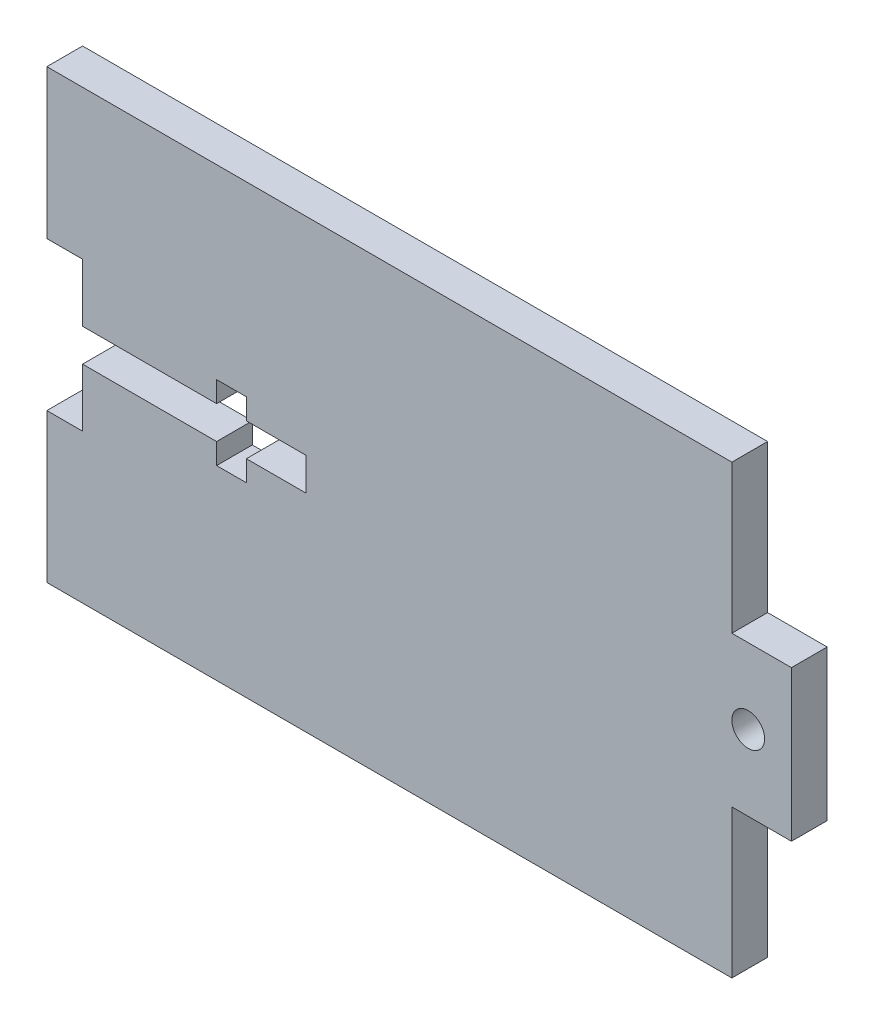
ISO-10303-21;
HEADER;
FILE_DESCRIPTION(('STEP AP214'),'2;1');
FILE_NAME('part.step','',(''),(''),'','','');
FILE_SCHEMA(('AUTOMOTIVE_DESIGN { 1 0 10303 214 1 1 1 1 }'));
ENDSEC;
DATA;
#1=APPLICATION_CONTEXT('core data for automotive mechanical design processes');
#2=APPLICATION_PROTOCOL_DEFINITION('international standard','automotive_design',2000,#1);
#3=PRODUCT_CONTEXT('',#1,'mechanical');
#4=PRODUCT('Part','Part','',(#3));
#5=PRODUCT_RELATED_PRODUCT_CATEGORY('part','',(#4));
#6=PRODUCT_DEFINITION_FORMATION('','',#4);
#7=PRODUCT_DEFINITION_CONTEXT('part definition',#1,'design');
#8=PRODUCT_DEFINITION('design','',#6,#7);
#9=PRODUCT_DEFINITION_SHAPE('','',#8);
#10=(LENGTH_UNIT() NAMED_UNIT(*) SI_UNIT(.MILLI.,.METRE.));
#11=(NAMED_UNIT(*) PLANE_ANGLE_UNIT() SI_UNIT($,.RADIAN.));
#12=(NAMED_UNIT(*) SI_UNIT($,.STERADIAN.) SOLID_ANGLE_UNIT());
#13=UNCERTAINTY_MEASURE_WITH_UNIT(LENGTH_MEASURE(1.E-05),#10,'distance_accuracy_value','');
#14=(GEOMETRIC_REPRESENTATION_CONTEXT(3) GLOBAL_UNCERTAINTY_ASSIGNED_CONTEXT((#13)) GLOBAL_UNIT_ASSIGNED_CONTEXT((#10,
#11,#12)) REPRESENTATION_CONTEXT('',''));
#15=CARTESIAN_POINT('',(0.,0.,0.));
#16=DIRECTION('',(0.,0.,1.));
#17=DIRECTION('',(1.,0.,0.));
#18=AXIS2_PLACEMENT_3D('',#15,#16,#17);
#19=CARTESIAN_POINT('',(0.,-19.05,3.048));
#20=DIRECTION('',(0.,-1.,0.));
#21=DIRECTION('',(1.,0.,0.));
#22=AXIS2_PLACEMENT_3D('',#19,#20,#21);
#23=PLANE('',#22);
#24=DIRECTION('',(-1.,0.,0.));
#25=VECTOR('',#24,1.);
#26=CARTESIAN_POINT('',(0.,-19.05,0.));
#27=LINE('',#26,#25);
#28=CARTESIAN_POINT('',(26.67,-19.05,0.));
#29=VERTEX_POINT('',#28);
#30=CARTESIAN_POINT('',(-31.75,-19.05,0.));
#31=VERTEX_POINT('',#30);
#32=EDGE_CURVE('E325',#29,#31,#27,.T.);
#33=ORIENTED_EDGE('',*,*,#32,.F.);
#34=DIRECTION('',(0.,0.,1.));
#35=VECTOR('',#34,1.);
#36=CARTESIAN_POINT('',(26.67,-19.05,-0.00199999999999983));
#37=LINE('',#36,#35);
#38=CARTESIAN_POINT('',(26.67,-19.05,3.048));
#39=VERTEX_POINT('',#38);
#40=EDGE_CURVE('E494',#29,#39,#37,.T.);
#41=ORIENTED_EDGE('',*,*,#40,.T.);
#42=DIRECTION('',(-1.,0.,0.));
#43=VECTOR('',#42,1.);
#44=CARTESIAN_POINT('',(0.,-19.05,3.048));
#45=LINE('',#44,#43);
#46=CARTESIAN_POINT('',(-31.75,-19.05,3.048));
#47=VERTEX_POINT('',#46);
#48=EDGE_CURVE('E266',#39,#47,#45,.T.);
#49=ORIENTED_EDGE('',*,*,#48,.T.);
#50=DIRECTION('',(0.,0.,-1.));
#51=VECTOR('',#50,1.);
#52=CARTESIAN_POINT('',(-31.75,-19.05,3.048));
#53=LINE('',#52,#51);
#54=EDGE_CURVE('E324',#47,#31,#53,.T.);
#55=ORIENTED_EDGE('',*,*,#54,.T.);
#56=EDGE_LOOP('',(#33,#41,#49,#55));
#57=FACE_BOUND('',#56,.T.);
#58=ADVANCED_FACE('F16',(#57),#23,.T.);
#59=CARTESIAN_POINT('',(31.75,0.,3.048));
#60=DIRECTION('',(1.,0.,0.));
#61=DIRECTION('',(0.,0.,-1.));
#62=AXIS2_PLACEMENT_3D('',#59,#60,#61);
#63=PLANE('',#62);
#64=DIRECTION('',(0.,-1.,0.));
#65=VECTOR('',#64,1.);
#66=CARTESIAN_POINT('',(31.75,0.,0.));
#67=LINE('',#66,#65);
#68=CARTESIAN_POINT('',(31.75,6.4135,0.));
#69=VERTEX_POINT('',#68);
#70=CARTESIAN_POINT('',(31.75,-6.4135,0.));
#71=VERTEX_POINT('',#70);
#72=EDGE_CURVE('E327',#69,#71,#67,.T.);
#73=ORIENTED_EDGE('',*,*,#72,.F.);
#74=DIRECTION('',(0.,0.,1.));
#75=VECTOR('',#74,1.);
#76=CARTESIAN_POINT('',(31.75,6.4135,-0.00199999999999983));
#77=LINE('',#76,#75);
#78=CARTESIAN_POINT('',(31.75,6.4135,3.048));
#79=VERTEX_POINT('',#78);
#80=EDGE_CURVE('E47',#69,#79,#77,.T.);
#81=ORIENTED_EDGE('',*,*,#80,.T.);
#82=DIRECTION('',(0.,-1.,0.));
#83=VECTOR('',#82,1.);
#84=CARTESIAN_POINT('',(31.75,0.,3.048));
#85=LINE('',#84,#83);
#86=CARTESIAN_POINT('',(31.75,-6.4135,3.048));
#87=VERTEX_POINT('',#86);
#88=EDGE_CURVE('E256',#79,#87,#85,.T.);
#89=ORIENTED_EDGE('',*,*,#88,.T.);
#90=DIRECTION('',(0.,0.,1.));
#91=VECTOR('',#90,1.);
#92=CARTESIAN_POINT('',(31.75,-6.4135,-0.00199999999999983));
#93=LINE('',#92,#91);
#94=EDGE_CURVE('E782',#71,#87,#93,.T.);
#95=ORIENTED_EDGE('',*,*,#94,.F.);
#96=EDGE_LOOP('',(#73,#81,#89,#95));
#97=FACE_BOUND('',#96,.T.);
#98=ADVANCED_FACE('F486',(#97),#63,.T.);
#99=CARTESIAN_POINT('',(0.,19.05,3.048));
#100=DIRECTION('',(0.,-1.,0.));
#101=DIRECTION('',(1.,0.,0.));
#102=AXIS2_PLACEMENT_3D('',#99,#100,#101);
#103=PLANE('',#102);
#104=DIRECTION('',(0.,0.,1.));
#105=VECTOR('',#104,1.);
#106=CARTESIAN_POINT('',(26.67,19.05,-0.00199999999999983));
#107=LINE('',#106,#105);
#108=CARTESIAN_POINT('',(26.67,19.05,0.));
#109=VERTEX_POINT('',#108);
#110=CARTESIAN_POINT('',(26.67,19.05,3.048));
#111=VERTEX_POINT('',#110);
#112=EDGE_CURVE('E230',#109,#111,#107,.T.);
#113=ORIENTED_EDGE('',*,*,#112,.F.);
#114=DIRECTION('',(-1.,0.,0.));
#115=VECTOR('',#114,1.);
#116=CARTESIAN_POINT('',(0.,19.05,0.));
#117=LINE('',#116,#115);
#118=CARTESIAN_POINT('',(-31.75,19.05,0.));
#119=VERTEX_POINT('',#118);
#120=EDGE_CURVE('E332',#109,#119,#117,.T.);
#121=ORIENTED_EDGE('',*,*,#120,.T.);
#122=DIRECTION('',(0.,0.,-1.));
#123=VECTOR('',#122,1.);
#124=CARTESIAN_POINT('',(-31.75,19.05,3.048));
#125=LINE('',#124,#123);
#126=CARTESIAN_POINT('',(-31.75,19.05,3.048));
#127=VERTEX_POINT('',#126);
#128=EDGE_CURVE('E10',#127,#119,#125,.T.);
#129=ORIENTED_EDGE('',*,*,#128,.F.);
#130=DIRECTION('',(-1.,0.,0.));
#131=VECTOR('',#130,1.);
#132=CARTESIAN_POINT('',(0.,19.05,3.048));
#133=LINE('',#132,#131);
#134=EDGE_CURVE('E246',#111,#127,#133,.T.);
#135=ORIENTED_EDGE('',*,*,#134,.F.);
#136=EDGE_LOOP('',(#113,#121,#129,#135));
#137=FACE_BOUND('',#136,.T.);
#138=ADVANCED_FACE('F252',(#137),#103,.F.);
#139=CARTESIAN_POINT('',(0.,0.,3.048));
#140=DIRECTION('',(0.,0.,1.));
#141=DIRECTION('',(1.,0.,0.));
#142=AXIS2_PLACEMENT_3D('',#139,#140,#141);
#143=PLANE('',#142);
#144=DIRECTION('',(0.,-1.,0.));
#145=VECTOR('',#144,1.);
#146=CARTESIAN_POINT('',(26.67,12.73175,3.048));
#147=LINE('',#146,#145);
#148=CARTESIAN_POINT('',(26.67,6.4135,3.048));
#149=VERTEX_POINT('',#148);
#150=EDGE_CURVE('E234',#111,#149,#147,.T.);
#151=ORIENTED_EDGE('',*,*,#150,.F.);
#152=ORIENTED_EDGE('',*,*,#134,.T.);
#153=DIRECTION('',(0.,-1.,0.));
#154=VECTOR('',#153,1.);
#155=CARTESIAN_POINT('',(-31.75,12.7,3.048));
#156=LINE('',#155,#154);
#157=CARTESIAN_POINT('',(-31.75,6.35,3.048));
#158=VERTEX_POINT('',#157);
#159=EDGE_CURVE('E255',#127,#158,#156,.T.);
#160=ORIENTED_EDGE('',*,*,#159,.T.);
#161=DIRECTION('',(1.,0.,0.));
#162=VECTOR('',#161,1.);
#163=CARTESIAN_POINT('',(-30.226,6.35,3.048));
#164=LINE('',#163,#162);
#165=CARTESIAN_POINT('',(-28.702,6.35,3.048));
#166=VERTEX_POINT('',#165);
#167=EDGE_CURVE('E262',#158,#166,#164,.T.);
#168=ORIENTED_EDGE('',*,*,#167,.T.);
#169=DIRECTION('',(0.,-1.,0.));
#170=VECTOR('',#169,1.);
#171=CARTESIAN_POINT('',(-28.702,3.8735,3.048));
#172=LINE('',#171,#170);
#173=CARTESIAN_POINT('',(-28.702,1.397,3.048));
#174=VERTEX_POINT('',#173);
#175=EDGE_CURVE('E272',#166,#174,#172,.T.);
#176=ORIENTED_EDGE('',*,*,#175,.T.);
#177=DIRECTION('',(1.,0.,0.));
#178=VECTOR('',#177,1.);
#179=CARTESIAN_POINT('',(-22.987,1.397,3.048));
#180=LINE('',#179,#178);
#181=CARTESIAN_POINT('',(-17.272,1.397,3.048));
#182=VERTEX_POINT('',#181);
#183=EDGE_CURVE('E275',#174,#182,#180,.T.);
#184=ORIENTED_EDGE('',*,*,#183,.T.);
#185=DIRECTION('',(0.,-1.,0.));
#186=VECTOR('',#185,1.);
#187=CARTESIAN_POINT('',(-17.272,2.286,3.048));
#188=LINE('',#187,#186);
#189=CARTESIAN_POINT('',(-17.272,3.175,3.048));
#190=VERTEX_POINT('',#189);
#191=EDGE_CURVE('E278',#190,#182,#188,.T.);
#192=ORIENTED_EDGE('',*,*,#191,.F.);
#193=DIRECTION('',(-1.,0.,0.));
#194=VECTOR('',#193,1.);
#195=CARTESIAN_POINT('',(-16.002,3.175,3.048));
#196=LINE('',#195,#194);
#197=CARTESIAN_POINT('',(-14.732,3.175,3.048));
#198=VERTEX_POINT('',#197);
#199=EDGE_CURVE('E282',#198,#190,#196,.T.);
#200=ORIENTED_EDGE('',*,*,#199,.F.);
#201=DIRECTION('',(0.,-1.,0.));
#202=VECTOR('',#201,1.);
#203=CARTESIAN_POINT('',(-14.732,2.286,3.048));
#204=LINE('',#203,#202);
#205=CARTESIAN_POINT('',(-14.732,1.397,3.048));
#206=VERTEX_POINT('',#205);
#207=EDGE_CURVE('E286',#198,#206,#204,.T.);
#208=ORIENTED_EDGE('',*,*,#207,.T.);
#209=DIRECTION('',(1.,0.,0.));
#210=VECTOR('',#209,1.);
#211=CARTESIAN_POINT('',(-12.192,1.397,3.048));
#212=LINE('',#211,#210);
#213=CARTESIAN_POINT('',(-9.652,1.397,3.048));
#214=VERTEX_POINT('',#213);
#215=EDGE_CURVE('E289',#206,#214,#212,.T.);
#216=ORIENTED_EDGE('',*,*,#215,.T.);
#217=DIRECTION('',(0.,-1.,0.));
#218=VECTOR('',#217,1.);
#219=CARTESIAN_POINT('',(-9.652,0.,3.048));
#220=LINE('',#219,#218);
#221=CARTESIAN_POINT('',(-9.652,-1.397,3.048));
#222=VERTEX_POINT('',#221);
#223=EDGE_CURVE('E292',#214,#222,#220,.T.);
#224=ORIENTED_EDGE('',*,*,#223,.T.);
#225=DIRECTION('',(1.,0.,0.));
#226=VECTOR('',#225,1.);
#227=CARTESIAN_POINT('',(-12.192,-1.397,3.048));
#228=LINE('',#227,#226);
#229=CARTESIAN_POINT('',(-14.732,-1.397,3.048));
#230=VERTEX_POINT('',#229);
#231=EDGE_CURVE('E295',#230,#222,#228,.T.);
#232=ORIENTED_EDGE('',*,*,#231,.F.);
#233=DIRECTION('',(0.,-1.,0.));
#234=VECTOR('',#233,1.);
#235=CARTESIAN_POINT('',(-14.732,-2.286,3.048));
#236=LINE('',#235,#234);
#237=CARTESIAN_POINT('',(-14.732,-3.175,3.048));
#238=VERTEX_POINT('',#237);
#239=EDGE_CURVE('E299',#230,#238,#236,.T.);
#240=ORIENTED_EDGE('',*,*,#239,.T.);
#241=DIRECTION('',(-1.,0.,0.));
#242=VECTOR('',#241,1.);
#243=CARTESIAN_POINT('',(-16.002,-3.175,3.048));
#244=LINE('',#243,#242);
#245=CARTESIAN_POINT('',(-17.272,-3.175,3.048));
#246=VERTEX_POINT('',#245);
#247=EDGE_CURVE('E302',#238,#246,#244,.T.);
#248=ORIENTED_EDGE('',*,*,#247,.T.);
#249=DIRECTION('',(0.,-1.,0.));
#250=VECTOR('',#249,1.);
#251=CARTESIAN_POINT('',(-17.272,-2.286,3.048));
#252=LINE('',#251,#250);
#253=CARTESIAN_POINT('',(-17.272,-1.397,3.048));
#254=VERTEX_POINT('',#253);
#255=EDGE_CURVE('E305',#254,#246,#252,.T.);
#256=ORIENTED_EDGE('',*,*,#255,.F.);
#257=DIRECTION('',(1.,0.,0.));
#258=VECTOR('',#257,1.);
#259=CARTESIAN_POINT('',(-22.987,-1.397,3.048));
#260=LINE('',#259,#258);
#261=CARTESIAN_POINT('',(-28.702,-1.397,3.048));
#262=VERTEX_POINT('',#261);
#263=EDGE_CURVE('E309',#262,#254,#260,.T.);
#264=ORIENTED_EDGE('',*,*,#263,.F.);
#265=DIRECTION('',(0.,-1.,0.));
#266=VECTOR('',#265,1.);
#267=CARTESIAN_POINT('',(-28.702,-3.8735,3.048));
#268=LINE('',#267,#266);
#269=CARTESIAN_POINT('',(-28.702,-6.35,3.048));
#270=VERTEX_POINT('',#269);
#271=EDGE_CURVE('E313',#262,#270,#268,.T.);
#272=ORIENTED_EDGE('',*,*,#271,.T.);
#273=DIRECTION('',(1.,0.,0.));
#274=VECTOR('',#273,1.);
#275=CARTESIAN_POINT('',(-30.226,-6.35,3.048));
#276=LINE('',#275,#274);
#277=CARTESIAN_POINT('',(-31.75,-6.35,3.048));
#278=VERTEX_POINT('',#277);
#279=EDGE_CURVE('E316',#278,#270,#276,.T.);
#280=ORIENTED_EDGE('',*,*,#279,.F.);
#281=DIRECTION('',(0.,-1.,0.));
#282=VECTOR('',#281,1.);
#283=CARTESIAN_POINT('',(-31.75,-12.7,3.048));
#284=LINE('',#283,#282);
#285=EDGE_CURVE('E320',#278,#47,#284,.T.);
#286=ORIENTED_EDGE('',*,*,#285,.T.);
#287=ORIENTED_EDGE('',*,*,#48,.F.);
#288=DIRECTION('',(0.,1.,0.));
#289=VECTOR('',#288,1.);
#290=CARTESIAN_POINT('',(26.67,-12.73175,3.048));
#291=LINE('',#290,#289);
#292=CARTESIAN_POINT('',(26.67,-6.4135,3.048));
#293=VERTEX_POINT('',#292);
#294=EDGE_CURVE('E780',#39,#293,#291,.T.);
#295=ORIENTED_EDGE('',*,*,#294,.T.);
#296=DIRECTION('',(1.,0.,0.));
#297=VECTOR('',#296,1.);
#298=CARTESIAN_POINT('',(29.21,-6.4135,3.048));
#299=LINE('',#298,#297);
#300=EDGE_CURVE('E521',#293,#87,#299,.T.);
#301=ORIENTED_EDGE('',*,*,#300,.T.);
#302=ORIENTED_EDGE('',*,*,#88,.F.);
#303=DIRECTION('',(1.,0.,0.));
#304=VECTOR('',#303,1.);
#305=CARTESIAN_POINT('',(29.21,6.4135,3.048));
#306=LINE('',#305,#304);
#307=EDGE_CURVE('E249',#149,#79,#306,.T.);
#308=ORIENTED_EDGE('',*,*,#307,.F.);
#309=EDGE_LOOP('',(#151,#152,#160,#168,#176,#184,#192,#200,#208,#216,#224,#232,#240,#248,#256,
#264,#272,#280,#286,#287,#295,#301,#302,#308));
#310=FACE_BOUND('',#309,.T.);
#311=CARTESIAN_POINT('',(28.067,0.,3.048));
#312=DIRECTION('',(0.,0.,1.));
#313=DIRECTION('',(1.,0.,0.));
#314=AXIS2_PLACEMENT_3D('',#311,#312,#313);
#315=CIRCLE('',#314,1.397);
#316=CARTESIAN_POINT('',(29.464,0.,3.048));
#317=VERTEX_POINT('',#316);
#318=EDGE_CURVE('E515',#317,#317,#315,.T.);
#319=ORIENTED_EDGE('',*,*,#318,.F.);
#320=EDGE_LOOP('',(#319));
#321=FACE_BOUND('',#320,.T.);
#322=ADVANCED_FACE('F244',(#310,#321),#143,.T.);
#323=CARTESIAN_POINT('',(0.,0.,0.));
#324=DIRECTION('',(0.,0.,1.));
#325=DIRECTION('',(1.,0.,0.));
#326=AXIS2_PLACEMENT_3D('',#323,#324,#325);
#327=PLANE('',#326);
#328=CARTESIAN_POINT('',(28.067,0.,0.));
#329=DIRECTION('',(0.,0.,1.));
#330=DIRECTION('',(1.,0.,0.));
#331=AXIS2_PLACEMENT_3D('',#328,#329,#330);
#332=CIRCLE('',#331,1.397);
#333=CARTESIAN_POINT('',(29.464,0.,0.));
#334=VERTEX_POINT('',#333);
#335=EDGE_CURVE('E518',#334,#334,#332,.F.);
#336=ORIENTED_EDGE('',*,*,#335,.F.);
#337=EDGE_LOOP('',(#336));
#338=FACE_BOUND('',#337,.T.);
#339=DIRECTION('',(0.,1.,0.));
#340=VECTOR('',#339,1.);
#341=CARTESIAN_POINT('',(26.67,12.73175,0.));
#342=LINE('',#341,#340);
#343=CARTESIAN_POINT('',(26.67,6.4135,0.));
#344=VERTEX_POINT('',#343);
#345=EDGE_CURVE('E237',#344,#109,#342,.T.);
#346=ORIENTED_EDGE('',*,*,#345,.F.);
#347=DIRECTION('',(-1.,0.,0.));
#348=VECTOR('',#347,1.);
#349=CARTESIAN_POINT('',(29.21,6.4135,0.));
#350=LINE('',#349,#348);
#351=EDGE_CURVE('E328',#69,#344,#350,.T.);
#352=ORIENTED_EDGE('',*,*,#351,.F.);
#353=ORIENTED_EDGE('',*,*,#72,.T.);
#354=DIRECTION('',(-1.,0.,0.));
#355=VECTOR('',#354,1.);
#356=CARTESIAN_POINT('',(29.21,-6.4135,0.));
#357=LINE('',#356,#355);
#358=CARTESIAN_POINT('',(26.67,-6.4135,0.));
#359=VERTEX_POINT('',#358);
#360=EDGE_CURVE('E502',#71,#359,#357,.T.);
#361=ORIENTED_EDGE('',*,*,#360,.T.);
#362=DIRECTION('',(0.,-1.,0.));
#363=VECTOR('',#362,1.);
#364=CARTESIAN_POINT('',(26.67,-12.73175,0.));
#365=LINE('',#364,#363);
#366=EDGE_CURVE('E501',#359,#29,#365,.T.);
#367=ORIENTED_EDGE('',*,*,#366,.T.);
#368=ORIENTED_EDGE('',*,*,#32,.T.);
#369=DIRECTION('',(0.,-1.,0.));
#370=VECTOR('',#369,1.);
#371=CARTESIAN_POINT('',(-31.75,-12.7,0.));
#372=LINE('',#371,#370);
#373=CARTESIAN_POINT('',(-31.75,-6.35,0.));
#374=VERTEX_POINT('',#373);
#375=EDGE_CURVE('E392',#374,#31,#372,.T.);
#376=ORIENTED_EDGE('',*,*,#375,.F.);
#377=DIRECTION('',(1.,0.,0.));
#378=VECTOR('',#377,1.);
#379=CARTESIAN_POINT('',(-30.226,-6.35,0.));
#380=LINE('',#379,#378);
#381=CARTESIAN_POINT('',(-28.702,-6.35,0.));
#382=VERTEX_POINT('',#381);
#383=EDGE_CURVE('E388',#374,#382,#380,.T.);
#384=ORIENTED_EDGE('',*,*,#383,.T.);
#385=DIRECTION('',(0.,-1.,0.));
#386=VECTOR('',#385,1.);
#387=CARTESIAN_POINT('',(-28.702,-3.8735,0.));
#388=LINE('',#387,#386);
#389=CARTESIAN_POINT('',(-28.702,-1.397,0.));
#390=VERTEX_POINT('',#389);
#391=EDGE_CURVE('E384',#390,#382,#388,.T.);
#392=ORIENTED_EDGE('',*,*,#391,.F.);
#393=DIRECTION('',(1.,0.,0.));
#394=VECTOR('',#393,1.);
#395=CARTESIAN_POINT('',(-22.987,-1.397,0.));
#396=LINE('',#395,#394);
#397=CARTESIAN_POINT('',(-17.272,-1.397,0.));
#398=VERTEX_POINT('',#397);
#399=EDGE_CURVE('E380',#390,#398,#396,.T.);
#400=ORIENTED_EDGE('',*,*,#399,.T.);
#401=DIRECTION('',(0.,-1.,0.));
#402=VECTOR('',#401,1.);
#403=CARTESIAN_POINT('',(-17.272,-2.286,0.));
#404=LINE('',#403,#402);
#405=CARTESIAN_POINT('',(-17.272,-3.175,0.));
#406=VERTEX_POINT('',#405);
#407=EDGE_CURVE('E376',#398,#406,#404,.T.);
#408=ORIENTED_EDGE('',*,*,#407,.T.);
#409=DIRECTION('',(-1.,0.,0.));
#410=VECTOR('',#409,1.);
#411=CARTESIAN_POINT('',(-16.002,-3.175,0.));
#412=LINE('',#411,#410);
#413=CARTESIAN_POINT('',(-14.732,-3.175,0.));
#414=VERTEX_POINT('',#413);
#415=EDGE_CURVE('E372',#414,#406,#412,.T.);
#416=ORIENTED_EDGE('',*,*,#415,.F.);
#417=DIRECTION('',(0.,-1.,0.));
#418=VECTOR('',#417,1.);
#419=CARTESIAN_POINT('',(-14.732,-2.286,0.));
#420=LINE('',#419,#418);
#421=CARTESIAN_POINT('',(-14.732,-1.397,0.));
#422=VERTEX_POINT('',#421);
#423=EDGE_CURVE('E369',#422,#414,#420,.T.);
#424=ORIENTED_EDGE('',*,*,#423,.F.);
#425=DIRECTION('',(1.,0.,0.));
#426=VECTOR('',#425,1.);
#427=CARTESIAN_POINT('',(-12.192,-1.397,0.));
#428=LINE('',#427,#426);
#429=CARTESIAN_POINT('',(-9.652,-1.397,0.));
#430=VERTEX_POINT('',#429);
#431=EDGE_CURVE('E365',#422,#430,#428,.T.);
#432=ORIENTED_EDGE('',*,*,#431,.T.);
#433=DIRECTION('',(0.,-1.,0.));
#434=VECTOR('',#433,1.);
#435=CARTESIAN_POINT('',(-9.652,0.,0.));
#436=LINE('',#435,#434);
#437=CARTESIAN_POINT('',(-9.652,1.397,0.));
#438=VERTEX_POINT('',#437);
#439=EDGE_CURVE('E361',#438,#430,#436,.T.);
#440=ORIENTED_EDGE('',*,*,#439,.F.);
#441=DIRECTION('',(1.,0.,0.));
#442=VECTOR('',#441,1.);
#443=CARTESIAN_POINT('',(-12.192,1.397,0.));
#444=LINE('',#443,#442);
#445=CARTESIAN_POINT('',(-14.732,1.397,0.));
#446=VERTEX_POINT('',#445);
#447=EDGE_CURVE('E358',#446,#438,#444,.T.);
#448=ORIENTED_EDGE('',*,*,#447,.F.);
#449=DIRECTION('',(0.,-1.,0.));
#450=VECTOR('',#449,1.);
#451=CARTESIAN_POINT('',(-14.732,2.286,0.));
#452=LINE('',#451,#450);
#453=CARTESIAN_POINT('',(-14.732,3.175,0.));
#454=VERTEX_POINT('',#453);
#455=EDGE_CURVE('E355',#454,#446,#452,.T.);
#456=ORIENTED_EDGE('',*,*,#455,.F.);
#457=DIRECTION('',(-1.,0.,0.));
#458=VECTOR('',#457,1.);
#459=CARTESIAN_POINT('',(-16.002,3.175,0.));
#460=LINE('',#459,#458);
#461=CARTESIAN_POINT('',(-17.272,3.175,0.));
#462=VERTEX_POINT('',#461);
#463=EDGE_CURVE('E351',#454,#462,#460,.T.);
#464=ORIENTED_EDGE('',*,*,#463,.T.);
#465=DIRECTION('',(0.,-1.,0.));
#466=VECTOR('',#465,1.);
#467=CARTESIAN_POINT('',(-17.272,2.286,0.));
#468=LINE('',#467,#466);
#469=CARTESIAN_POINT('',(-17.272,1.397,0.));
#470=VERTEX_POINT('',#469);
#471=EDGE_CURVE('E347',#462,#470,#468,.T.);
#472=ORIENTED_EDGE('',*,*,#471,.T.);
#473=DIRECTION('',(1.,0.,0.));
#474=VECTOR('',#473,1.);
#475=CARTESIAN_POINT('',(-22.987,1.397,0.));
#476=LINE('',#475,#474);
#477=CARTESIAN_POINT('',(-28.702,1.397,0.));
#478=VERTEX_POINT('',#477);
#479=EDGE_CURVE('E343',#478,#470,#476,.T.);
#480=ORIENTED_EDGE('',*,*,#479,.F.);
#481=DIRECTION('',(0.,-1.,0.));
#482=VECTOR('',#481,1.);
#483=CARTESIAN_POINT('',(-28.702,3.8735,0.));
#484=LINE('',#483,#482);
#485=CARTESIAN_POINT('',(-28.702,6.35,0.));
#486=VERTEX_POINT('',#485);
#487=EDGE_CURVE('E340',#486,#478,#484,.T.);
#488=ORIENTED_EDGE('',*,*,#487,.F.);
#489=DIRECTION('',(1.,0.,0.));
#490=VECTOR('',#489,1.);
#491=CARTESIAN_POINT('',(-30.226,6.35,0.));
#492=LINE('',#491,#490);
#493=CARTESIAN_POINT('',(-31.75,6.35,0.));
#494=VERTEX_POINT('',#493);
#495=EDGE_CURVE('E337',#494,#486,#492,.T.);
#496=ORIENTED_EDGE('',*,*,#495,.F.);
#497=DIRECTION('',(0.,-1.,0.));
#498=VECTOR('',#497,1.);
#499=CARTESIAN_POINT('',(-31.75,12.7,0.));
#500=LINE('',#499,#498);
#501=EDGE_CURVE('E334',#119,#494,#500,.T.);
#502=ORIENTED_EDGE('',*,*,#501,.F.);
#503=ORIENTED_EDGE('',*,*,#120,.F.);
#504=EDGE_LOOP('',(#346,#352,#353,#361,#367,#368,#376,#384,#392,#400,#408,#416,#424,#432,#440,
#448,#456,#464,#472,#480,#488,#496,#502,#503));
#505=FACE_BOUND('',#504,.T.);
#506=ADVANCED_FACE('F461',(#338,#505),#327,.F.);
#507=CARTESIAN_POINT('',(-31.75,12.7,3.048));
#508=DIRECTION('',(1.,0.,0.));
#509=DIRECTION('',(0.,0.,-1.));
#510=AXIS2_PLACEMENT_3D('',#507,#508,#509);
#511=PLANE('',#510);
#512=ORIENTED_EDGE('',*,*,#501,.T.);
#513=DIRECTION('',(0.,0.,-1.));
#514=VECTOR('',#513,1.);
#515=CARTESIAN_POINT('',(-31.75,6.35,3.048));
#516=LINE('',#515,#514);
#517=EDGE_CURVE('E24',#158,#494,#516,.T.);
#518=ORIENTED_EDGE('',*,*,#517,.F.);
#519=ORIENTED_EDGE('',*,*,#159,.F.);
#520=ORIENTED_EDGE('',*,*,#128,.T.);
#521=EDGE_LOOP('',(#512,#518,#519,#520));
#522=FACE_BOUND('',#521,.T.);
#523=ADVANCED_FACE('F473',(#522),#511,.F.);
#524=CARTESIAN_POINT('',(-30.226,6.35,3.048));
#525=DIRECTION('',(0.,1.,0.));
#526=DIRECTION('',(0.,0.,1.));
#527=AXIS2_PLACEMENT_3D('',#524,#525,#526);
#528=PLANE('',#527);
#529=ORIENTED_EDGE('',*,*,#495,.T.);
#530=DIRECTION('',(0.,0.,-1.));
#531=VECTOR('',#530,1.);
#532=CARTESIAN_POINT('',(-28.702,6.35,3.048));
#533=LINE('',#532,#531);
#534=EDGE_CURVE('E445',#166,#486,#533,.T.);
#535=ORIENTED_EDGE('',*,*,#534,.F.);
#536=ORIENTED_EDGE('',*,*,#167,.F.);
#537=ORIENTED_EDGE('',*,*,#517,.T.);
#538=EDGE_LOOP('',(#529,#535,#536,#537));
#539=FACE_BOUND('',#538,.T.);
#540=ADVANCED_FACE('F455',(#539),#528,.F.);
#541=CARTESIAN_POINT('',(-28.702,3.8735,3.048));
#542=DIRECTION('',(1.,0.,0.));
#543=DIRECTION('',(0.,0.,-1.));
#544=AXIS2_PLACEMENT_3D('',#541,#542,#543);
#545=PLANE('',#544);
#546=ORIENTED_EDGE('',*,*,#487,.T.);
#547=DIRECTION('',(0.,0.,-1.));
#548=VECTOR('',#547,1.);
#549=CARTESIAN_POINT('',(-28.702,1.397,3.048));
#550=LINE('',#549,#548);
#551=EDGE_CURVE('E441',#174,#478,#550,.T.);
#552=ORIENTED_EDGE('',*,*,#551,.F.);
#553=ORIENTED_EDGE('',*,*,#175,.F.);
#554=ORIENTED_EDGE('',*,*,#534,.T.);
#555=EDGE_LOOP('',(#546,#552,#553,#554));
#556=FACE_BOUND('',#555,.T.);
#557=ADVANCED_FACE('F465',(#556),#545,.F.);
#558=CARTESIAN_POINT('',(-22.987,1.397,3.048));
#559=DIRECTION('',(0.,1.,0.));
#560=DIRECTION('',(-1.,0.,0.));
#561=AXIS2_PLACEMENT_3D('',#558,#559,#560);
#562=PLANE('',#561);
#563=ORIENTED_EDGE('',*,*,#479,.T.);
#564=DIRECTION('',(0.,0.,-1.));
#565=VECTOR('',#564,1.);
#566=CARTESIAN_POINT('',(-17.272,1.397,3.048));
#567=LINE('',#566,#565);
#568=EDGE_CURVE('E438',#182,#470,#567,.T.);
#569=ORIENTED_EDGE('',*,*,#568,.F.);
#570=ORIENTED_EDGE('',*,*,#183,.F.);
#571=ORIENTED_EDGE('',*,*,#551,.T.);
#572=EDGE_LOOP('',(#563,#569,#570,#571));
#573=FACE_BOUND('',#572,.T.);
#574=ADVANCED_FACE('F469',(#573),#562,.F.);
#575=CARTESIAN_POINT('',(-17.272,2.286,3.048));
#576=DIRECTION('',(1.,0.,0.));
#577=DIRECTION('',(0.,0.,-1.));
#578=AXIS2_PLACEMENT_3D('',#575,#576,#577);
#579=PLANE('',#578);
#580=ORIENTED_EDGE('',*,*,#471,.F.);
#581=DIRECTION('',(0.,0.,-1.));
#582=VECTOR('',#581,1.);
#583=CARTESIAN_POINT('',(-17.272,3.175,3.048));
#584=LINE('',#583,#582);
#585=EDGE_CURVE('E435',#190,#462,#584,.T.);
#586=ORIENTED_EDGE('',*,*,#585,.F.);
#587=ORIENTED_EDGE('',*,*,#191,.T.);
#588=ORIENTED_EDGE('',*,*,#568,.T.);
#589=EDGE_LOOP('',(#580,#586,#587,#588));
#590=FACE_BOUND('',#589,.T.);
#591=ADVANCED_FACE('F577',(#590),#579,.T.);
#592=CARTESIAN_POINT('',(-16.002,3.175,3.048));
#593=DIRECTION('',(0.,-1.,0.));
#594=DIRECTION('',(1.,0.,0.));
#595=AXIS2_PLACEMENT_3D('',#592,#593,#594);
#596=PLANE('',#595);
#597=ORIENTED_EDGE('',*,*,#463,.F.);
#598=DIRECTION('',(0.,0.,-1.));
#599=VECTOR('',#598,1.);
#600=CARTESIAN_POINT('',(-14.732,3.175,3.048));
#601=LINE('',#600,#599);
#602=EDGE_CURVE('E432',#198,#454,#601,.T.);
#603=ORIENTED_EDGE('',*,*,#602,.F.);
#604=ORIENTED_EDGE('',*,*,#199,.T.);
#605=ORIENTED_EDGE('',*,*,#585,.T.);
#606=EDGE_LOOP('',(#597,#603,#604,#605));
#607=FACE_BOUND('',#606,.T.);
#608=ADVANCED_FACE('F574',(#607),#596,.T.);
#609=CARTESIAN_POINT('',(-14.732,2.286,3.048));
#610=DIRECTION('',(1.,0.,0.));
#611=DIRECTION('',(0.,0.,-1.));
#612=AXIS2_PLACEMENT_3D('',#609,#610,#611);
#613=PLANE('',#612);
#614=ORIENTED_EDGE('',*,*,#455,.T.);
#615=DIRECTION('',(0.,0.,-1.));
#616=VECTOR('',#615,1.);
#617=CARTESIAN_POINT('',(-14.732,1.397,3.048));
#618=LINE('',#617,#616);
#619=EDGE_CURVE('E428',#206,#446,#618,.T.);
#620=ORIENTED_EDGE('',*,*,#619,.F.);
#621=ORIENTED_EDGE('',*,*,#207,.F.);
#622=ORIENTED_EDGE('',*,*,#602,.T.);
#623=EDGE_LOOP('',(#614,#620,#621,#622));
#624=FACE_BOUND('',#623,.T.);
#625=ADVANCED_FACE('F571',(#624),#613,.F.);
#626=CARTESIAN_POINT('',(-12.192,1.397,3.048));
#627=DIRECTION('',(0.,1.,0.));
#628=DIRECTION('',(-1.,0.,0.));
#629=AXIS2_PLACEMENT_3D('',#626,#627,#628);
#630=PLANE('',#629);
#631=ORIENTED_EDGE('',*,*,#447,.T.);
#632=DIRECTION('',(0.,0.,-1.));
#633=VECTOR('',#632,1.);
#634=CARTESIAN_POINT('',(-9.652,1.397,3.048));
#635=LINE('',#634,#633);
#636=EDGE_CURVE('E424',#214,#438,#635,.T.);
#637=ORIENTED_EDGE('',*,*,#636,.F.);
#638=ORIENTED_EDGE('',*,*,#215,.F.);
#639=ORIENTED_EDGE('',*,*,#619,.T.);
#640=EDGE_LOOP('',(#631,#637,#638,#639));
#641=FACE_BOUND('',#640,.T.);
#642=ADVANCED_FACE('F567',(#641),#630,.F.);
#643=CARTESIAN_POINT('',(-9.652,0.,3.048));
#644=DIRECTION('',(1.,0.,0.));
#645=DIRECTION('',(0.,0.,-1.));
#646=AXIS2_PLACEMENT_3D('',#643,#644,#645);
#647=PLANE('',#646);
#648=ORIENTED_EDGE('',*,*,#439,.T.);
#649=DIRECTION('',(0.,0.,-1.));
#650=VECTOR('',#649,1.);
#651=CARTESIAN_POINT('',(-9.652,-1.397,3.048));
#652=LINE('',#651,#650);
#653=EDGE_CURVE('E421',#222,#430,#652,.T.);
#654=ORIENTED_EDGE('',*,*,#653,.F.);
#655=ORIENTED_EDGE('',*,*,#223,.F.);
#656=ORIENTED_EDGE('',*,*,#636,.T.);
#657=EDGE_LOOP('',(#648,#654,#655,#656));
#658=FACE_BOUND('',#657,.T.);
#659=ADVANCED_FACE('F562',(#658),#647,.F.);
#660=CARTESIAN_POINT('',(-12.192,-1.397,3.048));
#661=DIRECTION('',(0.,1.,0.));
#662=DIRECTION('',(-1.,0.,0.));
#663=AXIS2_PLACEMENT_3D('',#660,#661,#662);
#664=PLANE('',#663);
#665=ORIENTED_EDGE('',*,*,#431,.F.);
#666=DIRECTION('',(0.,0.,-1.));
#667=VECTOR('',#666,1.);
#668=CARTESIAN_POINT('',(-14.732,-1.397,3.048));
#669=LINE('',#668,#667);
#670=EDGE_CURVE('E418',#230,#422,#669,.T.);
#671=ORIENTED_EDGE('',*,*,#670,.F.);
#672=ORIENTED_EDGE('',*,*,#231,.T.);
#673=ORIENTED_EDGE('',*,*,#653,.T.);
#674=EDGE_LOOP('',(#665,#671,#672,#673));
#675=FACE_BOUND('',#674,.T.);
#676=ADVANCED_FACE('F556',(#675),#664,.T.);
#677=CARTESIAN_POINT('',(-14.732,-2.286,3.048));
#678=DIRECTION('',(1.,0.,0.));
#679=DIRECTION('',(0.,0.,-1.));
#680=AXIS2_PLACEMENT_3D('',#677,#678,#679);
#681=PLANE('',#680);
#682=ORIENTED_EDGE('',*,*,#423,.T.);
#683=DIRECTION('',(0.,0.,-1.));
#684=VECTOR('',#683,1.);
#685=CARTESIAN_POINT('',(-14.732,-3.175,3.048));
#686=LINE('',#685,#684);
#687=EDGE_CURVE('E414',#238,#414,#686,.T.);
#688=ORIENTED_EDGE('',*,*,#687,.F.);
#689=ORIENTED_EDGE('',*,*,#239,.F.);
#690=ORIENTED_EDGE('',*,*,#670,.T.);
#691=EDGE_LOOP('',(#682,#688,#689,#690));
#692=FACE_BOUND('',#691,.T.);
#693=ADVANCED_FACE('F553',(#692),#681,.F.);
#694=CARTESIAN_POINT('',(-16.002,-3.175,3.048));
#695=DIRECTION('',(0.,-1.,0.));
#696=DIRECTION('',(0.,0.,-1.));
#697=AXIS2_PLACEMENT_3D('',#694,#695,#696);
#698=PLANE('',#697);
#699=ORIENTED_EDGE('',*,*,#415,.T.);
#700=DIRECTION('',(0.,0.,-1.));
#701=VECTOR('',#700,1.);
#702=CARTESIAN_POINT('',(-17.272,-3.175,3.048));
#703=LINE('',#702,#701);
#704=EDGE_CURVE('E411',#246,#406,#703,.T.);
#705=ORIENTED_EDGE('',*,*,#704,.F.);
#706=ORIENTED_EDGE('',*,*,#247,.F.);
#707=ORIENTED_EDGE('',*,*,#687,.T.);
#708=EDGE_LOOP('',(#699,#705,#706,#707));
#709=FACE_BOUND('',#708,.T.);
#710=ADVANCED_FACE('F548',(#709),#698,.F.);
#711=CARTESIAN_POINT('',(-17.272,-2.286,3.048));
#712=DIRECTION('',(1.,0.,0.));
#713=DIRECTION('',(0.,0.,-1.));
#714=AXIS2_PLACEMENT_3D('',#711,#712,#713);
#715=PLANE('',#714);
#716=ORIENTED_EDGE('',*,*,#407,.F.);
#717=DIRECTION('',(0.,0.,-1.));
#718=VECTOR('',#717,1.);
#719=CARTESIAN_POINT('',(-17.272,-1.397,3.048));
#720=LINE('',#719,#718);
#721=EDGE_CURVE('E408',#254,#398,#720,.T.);
#722=ORIENTED_EDGE('',*,*,#721,.F.);
#723=ORIENTED_EDGE('',*,*,#255,.T.);
#724=ORIENTED_EDGE('',*,*,#704,.T.);
#725=EDGE_LOOP('',(#716,#722,#723,#724));
#726=FACE_BOUND('',#725,.T.);
#727=ADVANCED_FACE('F542',(#726),#715,.T.);
#728=CARTESIAN_POINT('',(-22.987,-1.397,3.048));
#729=DIRECTION('',(0.,1.,0.));
#730=DIRECTION('',(-1.,0.,0.));
#731=AXIS2_PLACEMENT_3D('',#728,#729,#730);
#732=PLANE('',#731);
#733=ORIENTED_EDGE('',*,*,#399,.F.);
#734=DIRECTION('',(0.,0.,-1.));
#735=VECTOR('',#734,1.);
#736=CARTESIAN_POINT('',(-28.702,-1.397,3.048));
#737=LINE('',#736,#735);
#738=EDGE_CURVE('E405',#262,#390,#737,.T.);
#739=ORIENTED_EDGE('',*,*,#738,.F.);
#740=ORIENTED_EDGE('',*,*,#263,.T.);
#741=ORIENTED_EDGE('',*,*,#721,.T.);
#742=EDGE_LOOP('',(#733,#739,#740,#741));
#743=FACE_BOUND('',#742,.T.);
#744=ADVANCED_FACE('F536',(#743),#732,.T.);
#745=CARTESIAN_POINT('',(-28.702,-3.8735,3.048));
#746=DIRECTION('',(1.,0.,0.));
#747=DIRECTION('',(0.,0.,-1.));
#748=AXIS2_PLACEMENT_3D('',#745,#746,#747);
#749=PLANE('',#748);
#750=ORIENTED_EDGE('',*,*,#391,.T.);
#751=DIRECTION('',(0.,0.,-1.));
#752=VECTOR('',#751,1.);
#753=CARTESIAN_POINT('',(-28.702,-6.35,3.048));
#754=LINE('',#753,#752);
#755=EDGE_CURVE('E402',#270,#382,#754,.T.);
#756=ORIENTED_EDGE('',*,*,#755,.F.);
#757=ORIENTED_EDGE('',*,*,#271,.F.);
#758=ORIENTED_EDGE('',*,*,#738,.T.);
#759=EDGE_LOOP('',(#750,#756,#757,#758));
#760=FACE_BOUND('',#759,.T.);
#761=ADVANCED_FACE('F608',(#760),#749,.F.);
#762=CARTESIAN_POINT('',(-30.226,-6.35,3.048));
#763=DIRECTION('',(0.,1.,0.));
#764=DIRECTION('',(0.,0.,1.));
#765=AXIS2_PLACEMENT_3D('',#762,#763,#764);
#766=PLANE('',#765);
#767=ORIENTED_EDGE('',*,*,#383,.F.);
#768=DIRECTION('',(0.,0.,-1.));
#769=VECTOR('',#768,1.);
#770=CARTESIAN_POINT('',(-31.75,-6.35,3.048));
#771=LINE('',#770,#769);
#772=EDGE_CURVE('E399',#278,#374,#771,.T.);
#773=ORIENTED_EDGE('',*,*,#772,.F.);
#774=ORIENTED_EDGE('',*,*,#279,.T.);
#775=ORIENTED_EDGE('',*,*,#755,.T.);
#776=EDGE_LOOP('',(#767,#773,#774,#775));
#777=FACE_BOUND('',#776,.T.);
#778=ADVANCED_FACE('F530',(#777),#766,.T.);
#779=CARTESIAN_POINT('',(-31.75,-12.7,3.048));
#780=DIRECTION('',(1.,0.,0.));
#781=DIRECTION('',(0.,0.,-1.));
#782=AXIS2_PLACEMENT_3D('',#779,#780,#781);
#783=PLANE('',#782);
#784=ORIENTED_EDGE('',*,*,#375,.T.);
#785=ORIENTED_EDGE('',*,*,#54,.F.);
#786=ORIENTED_EDGE('',*,*,#285,.F.);
#787=ORIENTED_EDGE('',*,*,#772,.T.);
#788=EDGE_LOOP('',(#784,#785,#786,#787));
#789=FACE_BOUND('',#788,.T.);
#790=ADVANCED_FACE('F528',(#789),#783,.F.);
#791=CARTESIAN_POINT('',(28.067,0.,-0.00199999999999983));
#792=DIRECTION('',(0.,0.,1.));
#793=DIRECTION('',(1.,0.,0.));
#794=AXIS2_PLACEMENT_3D('',#791,#792,#793);
#795=CYLINDRICAL_SURFACE('',#794,1.397);
#796=ORIENTED_EDGE('',*,*,#335,.T.);
#797=EDGE_LOOP('',(#796));
#798=FACE_BOUND('',#797,.T.);
#799=ORIENTED_EDGE('',*,*,#318,.T.);
#800=EDGE_LOOP('',(#799));
#801=FACE_BOUND('',#800,.T.);
#802=ADVANCED_FACE('F665',(#798,#801),#795,.F.);
#803=CARTESIAN_POINT('',(26.67,-12.73175,-0.00199999999999983));
#804=DIRECTION('',(1.,0.,0.));
#805=DIRECTION('',(0.,0.,-1.));
#806=AXIS2_PLACEMENT_3D('',#803,#804,#805);
#807=PLANE('',#806);
#808=DIRECTION('',(0.,0.,1.));
#809=VECTOR('',#808,1.);
#810=CARTESIAN_POINT('',(26.67,-6.4135,-0.00199999999999983));
#811=LINE('',#810,#809);
#812=EDGE_CURVE('E36',#359,#293,#811,.T.);
#813=ORIENTED_EDGE('',*,*,#812,.T.);
#814=ORIENTED_EDGE('',*,*,#294,.F.);
#815=ORIENTED_EDGE('',*,*,#40,.F.);
#816=ORIENTED_EDGE('',*,*,#366,.F.);
#817=EDGE_LOOP('',(#813,#814,#815,#816));
#818=FACE_BOUND('',#817,.T.);
#819=ADVANCED_FACE('F671',(#818),#807,.T.);
#820=CARTESIAN_POINT('',(29.21,-6.4135,-0.00199999999999983));
#821=DIRECTION('',(0.,-1.,0.));
#822=DIRECTION('',(0.,0.,-1.));
#823=AXIS2_PLACEMENT_3D('',#820,#821,#822);
#824=PLANE('',#823);
#825=ORIENTED_EDGE('',*,*,#94,.T.);
#826=ORIENTED_EDGE('',*,*,#300,.F.);
#827=ORIENTED_EDGE('',*,*,#812,.F.);
#828=ORIENTED_EDGE('',*,*,#360,.F.);
#829=EDGE_LOOP('',(#825,#826,#827,#828));
#830=FACE_BOUND('',#829,.T.);
#831=ADVANCED_FACE('F673',(#830),#824,.T.);
#832=CARTESIAN_POINT('',(26.67,12.73175,-0.00199999999999983));
#833=DIRECTION('',(-1.,0.,0.));
#834=DIRECTION('',(0.,0.,1.));
#835=AXIS2_PLACEMENT_3D('',#832,#833,#834);
#836=PLANE('',#835);
#837=ORIENTED_EDGE('',*,*,#345,.T.);
#838=ORIENTED_EDGE('',*,*,#112,.T.);
#839=ORIENTED_EDGE('',*,*,#150,.T.);
#840=DIRECTION('',(0.,0.,1.));
#841=VECTOR('',#840,1.);
#842=CARTESIAN_POINT('',(26.67,6.4135,-0.00199999999999983));
#843=LINE('',#842,#841);
#844=EDGE_CURVE('E767',#344,#149,#843,.T.);
#845=ORIENTED_EDGE('',*,*,#844,.F.);
#846=EDGE_LOOP('',(#837,#838,#839,#845));
#847=FACE_BOUND('',#846,.T.);
#848=ADVANCED_FACE('F232',(#847),#836,.F.);
#849=CARTESIAN_POINT('',(29.21,6.4135,-0.00199999999999983));
#850=DIRECTION('',(0.,-1.,0.));
#851=DIRECTION('',(0.,0.,-1.));
#852=AXIS2_PLACEMENT_3D('',#849,#850,#851);
#853=PLANE('',#852);
#854=ORIENTED_EDGE('',*,*,#351,.T.);
#855=ORIENTED_EDGE('',*,*,#844,.T.);
#856=ORIENTED_EDGE('',*,*,#307,.T.);
#857=ORIENTED_EDGE('',*,*,#80,.F.);
#858=EDGE_LOOP('',(#854,#855,#856,#857));
#859=FACE_BOUND('',#858,.T.);
#860=ADVANCED_FACE('F678',(#859),#853,.F.);
#861=CLOSED_SHELL('',(#58,#98,#138,#322,#506,#523,#540,#557,#574,#591,#608,#625,#642,#659,#676,
#693,#710,#727,#744,#761,#778,#790,#802,#819,#831,#848,#860));
#862=MANIFOLD_SOLID_BREP('B1',#861);
#863=ADVANCED_BREP_SHAPE_REPRESENTATION('',(#18,#862),#14);
#864=SHAPE_DEFINITION_REPRESENTATION(#9,#863);
ENDSEC;
END-ISO-10303-21;
